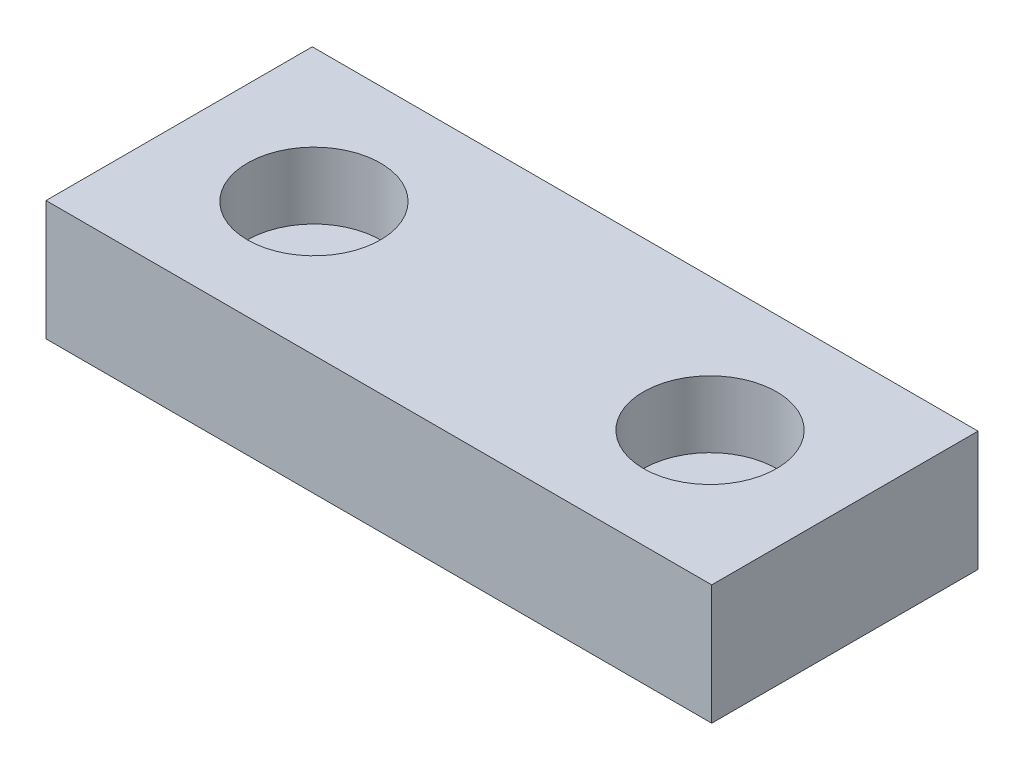
ISO-10303-21;
HEADER;
FILE_DESCRIPTION(('STEP AP214'),'2;1');
FILE_NAME('part.step','',(''),(''),'','','');
FILE_SCHEMA(('AUTOMOTIVE_DESIGN { 1 0 10303 214 1 1 1 1 }'));
ENDSEC;
DATA;
#1=APPLICATION_CONTEXT('core data for automotive mechanical design processes');
#2=APPLICATION_PROTOCOL_DEFINITION('international standard','automotive_design',2000,#1);
#3=PRODUCT_CONTEXT('',#1,'mechanical');
#4=PRODUCT('Part','Part','',(#3));
#5=PRODUCT_RELATED_PRODUCT_CATEGORY('part','',(#4));
#6=PRODUCT_DEFINITION_FORMATION('','',#4);
#7=PRODUCT_DEFINITION_CONTEXT('part definition',#1,'design');
#8=PRODUCT_DEFINITION('design','',#6,#7);
#9=PRODUCT_DEFINITION_SHAPE('','',#8);
#10=(LENGTH_UNIT() NAMED_UNIT(*) SI_UNIT(.MILLI.,.METRE.));
#11=(NAMED_UNIT(*) PLANE_ANGLE_UNIT() SI_UNIT($,.RADIAN.));
#12=(NAMED_UNIT(*) SI_UNIT($,.STERADIAN.) SOLID_ANGLE_UNIT());
#13=UNCERTAINTY_MEASURE_WITH_UNIT(LENGTH_MEASURE(1.E-05),#10,'distance_accuracy_value','');
#14=(GEOMETRIC_REPRESENTATION_CONTEXT(3) GLOBAL_UNCERTAINTY_ASSIGNED_CONTEXT((#13)) GLOBAL_UNIT_ASSIGNED_CONTEXT((#10,
#11,#12)) REPRESENTATION_CONTEXT('',''));
#15=CARTESIAN_POINT('',(0.,0.,0.));
#16=DIRECTION('',(0.,0.,1.));
#17=DIRECTION('',(1.,0.,0.));
#18=AXIS2_PLACEMENT_3D('',#15,#16,#17);
#19=CARTESIAN_POINT('',(0.,18.,20.));
#20=DIRECTION('',(0.,0.,-1.));
#21=DIRECTION('',(-1.,0.,0.));
#22=AXIS2_PLACEMENT_3D('',#19,#20,#21);
#23=PLANE('',#22);
#24=DIRECTION('',(1.,0.,0.));
#25=VECTOR('',#24,1.);
#26=CARTESIAN_POINT('',(0.,0.,20.));
#27=LINE('',#26,#25);
#28=CARTESIAN_POINT('',(-50.,0.,20.));
#29=VERTEX_POINT('',#28);
#30=CARTESIAN_POINT('',(50.,0.,20.));
#31=VERTEX_POINT('',#30);
#32=EDGE_CURVE('E112',#29,#31,#27,.T.);
#33=ORIENTED_EDGE('',*,*,#32,.T.);
#34=DIRECTION('',(0.,-1.,0.));
#35=VECTOR('',#34,1.);
#36=CARTESIAN_POINT('',(50.,18.,20.));
#37=LINE('',#36,#35);
#38=CARTESIAN_POINT('',(50.,18.,20.));
#39=VERTEX_POINT('',#38);
#40=EDGE_CURVE('E11',#39,#31,#37,.T.);
#41=ORIENTED_EDGE('',*,*,#40,.F.);
#42=DIRECTION('',(1.,0.,0.));
#43=VECTOR('',#42,1.);
#44=CARTESIAN_POINT('',(0.,18.,20.));
#45=LINE('',#44,#43);
#46=CARTESIAN_POINT('',(-50.,18.,20.));
#47=VERTEX_POINT('',#46);
#48=EDGE_CURVE('E92',#47,#39,#45,.T.);
#49=ORIENTED_EDGE('',*,*,#48,.F.);
#50=DIRECTION('',(0.,-1.,0.));
#51=VECTOR('',#50,1.);
#52=CARTESIAN_POINT('',(-50.,18.,20.));
#53=LINE('',#52,#51);
#54=EDGE_CURVE('E59',#47,#29,#53,.T.);
#55=ORIENTED_EDGE('',*,*,#54,.T.);
#56=EDGE_LOOP('',(#33,#41,#49,#55));
#57=FACE_BOUND('',#56,.T.);
#58=ADVANCED_FACE('F42',(#57),#23,.F.);
#59=CARTESIAN_POINT('',(50.,18.,0.));
#60=DIRECTION('',(-1.,0.,0.));
#61=DIRECTION('',(0.,0.,1.));
#62=AXIS2_PLACEMENT_3D('',#59,#60,#61);
#63=PLANE('',#62);
#64=DIRECTION('',(0.,0.,-1.));
#65=VECTOR('',#64,1.);
#66=CARTESIAN_POINT('',(50.,0.,0.));
#67=LINE('',#66,#65);
#68=CARTESIAN_POINT('',(50.,0.,-20.));
#69=VERTEX_POINT('',#68);
#70=EDGE_CURVE('E98',#31,#69,#67,.T.);
#71=ORIENTED_EDGE('',*,*,#70,.T.);
#72=DIRECTION('',(0.,-1.,0.));
#73=VECTOR('',#72,1.);
#74=CARTESIAN_POINT('',(50.,18.,-20.));
#75=LINE('',#74,#73);
#76=CARTESIAN_POINT('',(50.,18.,-20.));
#77=VERTEX_POINT('',#76);
#78=EDGE_CURVE('E51',#77,#69,#75,.T.);
#79=ORIENTED_EDGE('',*,*,#78,.F.);
#80=DIRECTION('',(0.,0.,-1.));
#81=VECTOR('',#80,1.);
#82=CARTESIAN_POINT('',(50.,18.,0.));
#83=LINE('',#82,#81);
#84=EDGE_CURVE('E84',#39,#77,#83,.T.);
#85=ORIENTED_EDGE('',*,*,#84,.F.);
#86=ORIENTED_EDGE('',*,*,#40,.T.);
#87=EDGE_LOOP('',(#71,#79,#85,#86));
#88=FACE_BOUND('',#87,.T.);
#89=ADVANCED_FACE('F97',(#88),#63,.F.);
#90=CARTESIAN_POINT('',(0.,18.,-20.));
#91=DIRECTION('',(0.,0.,-1.));
#92=DIRECTION('',(-1.,0.,0.));
#93=AXIS2_PLACEMENT_3D('',#90,#91,#92);
#94=PLANE('',#93);
#95=DIRECTION('',(1.,0.,0.));
#96=VECTOR('',#95,1.);
#97=CARTESIAN_POINT('',(0.,0.,-20.));
#98=LINE('',#97,#96);
#99=CARTESIAN_POINT('',(-50.,0.,-20.));
#100=VERTEX_POINT('',#99);
#101=EDGE_CURVE('E118',#100,#69,#98,.T.);
#102=ORIENTED_EDGE('',*,*,#101,.F.);
#103=DIRECTION('',(0.,-1.,0.));
#104=VECTOR('',#103,1.);
#105=CARTESIAN_POINT('',(-50.,18.,-20.));
#106=LINE('',#105,#104);
#107=CARTESIAN_POINT('',(-50.,18.,-20.));
#108=VERTEX_POINT('',#107);
#109=EDGE_CURVE('E73',#108,#100,#106,.T.);
#110=ORIENTED_EDGE('',*,*,#109,.F.);
#111=DIRECTION('',(1.,0.,0.));
#112=VECTOR('',#111,1.);
#113=CARTESIAN_POINT('',(0.,18.,-20.));
#114=LINE('',#113,#112);
#115=EDGE_CURVE('E91',#108,#77,#114,.T.);
#116=ORIENTED_EDGE('',*,*,#115,.T.);
#117=ORIENTED_EDGE('',*,*,#78,.T.);
#118=EDGE_LOOP('',(#102,#110,#116,#117));
#119=FACE_BOUND('',#118,.T.);
#120=ADVANCED_FACE('F102',(#119),#94,.T.);
#121=CARTESIAN_POINT('',(-50.,18.,0.));
#122=DIRECTION('',(-1.,0.,0.));
#123=DIRECTION('',(0.,0.,1.));
#124=AXIS2_PLACEMENT_3D('',#121,#122,#123);
#125=PLANE('',#124);
#126=DIRECTION('',(0.,0.,-1.));
#127=VECTOR('',#126,1.);
#128=CARTESIAN_POINT('',(-50.,0.,0.));
#129=LINE('',#128,#127);
#130=EDGE_CURVE('E121',#29,#100,#129,.T.);
#131=ORIENTED_EDGE('',*,*,#130,.F.);
#132=ORIENTED_EDGE('',*,*,#54,.F.);
#133=DIRECTION('',(0.,0.,-1.));
#134=VECTOR('',#133,1.);
#135=CARTESIAN_POINT('',(-50.,18.,0.));
#136=LINE('',#135,#134);
#137=EDGE_CURVE('E104',#47,#108,#136,.T.);
#138=ORIENTED_EDGE('',*,*,#137,.T.);
#139=ORIENTED_EDGE('',*,*,#109,.T.);
#140=EDGE_LOOP('',(#131,#132,#138,#139));
#141=FACE_BOUND('',#140,.T.);
#142=ADVANCED_FACE('F158',(#141),#125,.T.);
#143=CARTESIAN_POINT('',(0.,18.,0.));
#144=DIRECTION('',(0.,1.,0.));
#145=DIRECTION('',(0.,0.,1.));
#146=AXIS2_PLACEMENT_3D('',#143,#144,#145);
#147=PLANE('',#146);
#148=CARTESIAN_POINT('',(-29.75,18.,0.));
#149=DIRECTION('',(0.,1.,0.));
#150=DIRECTION('',(0.,0.,1.));
#151=AXIS2_PLACEMENT_3D('',#148,#149,#150);
#152=CIRCLE('',#151,10.);
#153=CARTESIAN_POINT('',(-29.75,18.,10.));
#154=VERTEX_POINT('',#153);
#155=EDGE_CURVE('E130',#154,#154,#152,.T.);
#156=ORIENTED_EDGE('',*,*,#155,.F.);
#157=EDGE_LOOP('',(#156));
#158=FACE_BOUND('',#157,.T.);
#159=CARTESIAN_POINT('',(29.75,18.,0.));
#160=DIRECTION('',(0.,1.,0.));
#161=DIRECTION('',(0.,0.,1.));
#162=AXIS2_PLACEMENT_3D('',#159,#160,#161);
#163=CIRCLE('',#162,10.);
#164=CARTESIAN_POINT('',(29.75,18.,10.));
#165=VERTEX_POINT('',#164);
#166=EDGE_CURVE('E131',#165,#165,#163,.T.);
#167=ORIENTED_EDGE('',*,*,#166,.F.);
#168=EDGE_LOOP('',(#167));
#169=FACE_BOUND('',#168,.T.);
#170=ORIENTED_EDGE('',*,*,#48,.T.);
#171=ORIENTED_EDGE('',*,*,#84,.T.);
#172=ORIENTED_EDGE('',*,*,#115,.F.);
#173=ORIENTED_EDGE('',*,*,#137,.F.);
#174=EDGE_LOOP('',(#170,#171,#172,#173));
#175=FACE_BOUND('',#174,.T.);
#176=ADVANCED_FACE('F88',(#158,#169,#175),#147,.T.);
#177=CARTESIAN_POINT('',(0.,0.,0.));
#178=DIRECTION('',(0.,1.,0.));
#179=DIRECTION('',(0.,0.,1.));
#180=AXIS2_PLACEMENT_3D('',#177,#178,#179);
#181=PLANE('',#180);
#182=ORIENTED_EDGE('',*,*,#32,.F.);
#183=ORIENTED_EDGE('',*,*,#130,.T.);
#184=ORIENTED_EDGE('',*,*,#101,.T.);
#185=ORIENTED_EDGE('',*,*,#70,.F.);
#186=EDGE_LOOP('',(#182,#183,#184,#185));
#187=FACE_BOUND('',#186,.T.);
#188=ADVANCED_FACE('F157',(#187),#181,.F.);
#189=CARTESIAN_POINT('',(29.75,8.,0.));
#190=DIRECTION('',(0.,1.,0.));
#191=DIRECTION('',(0.,0.,1.));
#192=AXIS2_PLACEMENT_3D('',#189,#190,#191);
#193=CYLINDRICAL_SURFACE('',#192,10.);
#194=CARTESIAN_POINT('',(29.75,8.,0.));
#195=DIRECTION('',(0.,1.,0.));
#196=DIRECTION('',(0.,0.,1.));
#197=AXIS2_PLACEMENT_3D('',#194,#195,#196);
#198=CIRCLE('',#197,10.);
#199=CARTESIAN_POINT('',(29.75,8.,10.));
#200=VERTEX_POINT('',#199);
#201=EDGE_CURVE('E128',#200,#200,#198,.T.);
#202=ORIENTED_EDGE('',*,*,#201,.F.);
#203=EDGE_LOOP('',(#202));
#204=FACE_BOUND('',#203,.T.);
#205=ORIENTED_EDGE('',*,*,#166,.T.);
#206=EDGE_LOOP('',(#205));
#207=FACE_BOUND('',#206,.T.);
#208=ADVANCED_FACE('F162',(#204,#207),#193,.F.);
#209=CARTESIAN_POINT('',(29.75,8.,0.));
#210=DIRECTION('',(0.,1.,0.));
#211=DIRECTION('',(0.,0.,1.));
#212=AXIS2_PLACEMENT_3D('',#209,#210,#211);
#213=PLANE('',#212);
#214=ORIENTED_EDGE('',*,*,#201,.T.);
#215=EDGE_LOOP('',(#214));
#216=FACE_BOUND('',#215,.T.);
#217=ADVANCED_FACE('F151',(#216),#213,.T.);
#218=CARTESIAN_POINT('',(-29.75,8.,0.));
#219=DIRECTION('',(0.,1.,0.));
#220=DIRECTION('',(0.,0.,1.));
#221=AXIS2_PLACEMENT_3D('',#218,#219,#220);
#222=CYLINDRICAL_SURFACE('',#221,10.);
#223=CARTESIAN_POINT('',(-29.75,8.,0.));
#224=DIRECTION('',(0.,1.,0.));
#225=DIRECTION('',(0.,0.,1.));
#226=AXIS2_PLACEMENT_3D('',#223,#224,#225);
#227=CIRCLE('',#226,10.);
#228=CARTESIAN_POINT('',(-29.75,8.,10.));
#229=VERTEX_POINT('',#228);
#230=EDGE_CURVE('E115',#229,#229,#227,.T.);
#231=ORIENTED_EDGE('',*,*,#230,.F.);
#232=EDGE_LOOP('',(#231));
#233=FACE_BOUND('',#232,.T.);
#234=ORIENTED_EDGE('',*,*,#155,.T.);
#235=EDGE_LOOP('',(#234));
#236=FACE_BOUND('',#235,.T.);
#237=ADVANCED_FACE('F148',(#233,#236),#222,.F.);
#238=CARTESIAN_POINT('',(-29.75,8.,0.));
#239=DIRECTION('',(0.,1.,0.));
#240=DIRECTION('',(0.,0.,1.));
#241=AXIS2_PLACEMENT_3D('',#238,#239,#240);
#242=PLANE('',#241);
#243=ORIENTED_EDGE('',*,*,#230,.T.);
#244=EDGE_LOOP('',(#243));
#245=FACE_BOUND('',#244,.T.);
#246=ADVANCED_FACE('F146',(#245),#242,.T.);
#247=CLOSED_SHELL('',(#58,#89,#120,#142,#176,#188,#208,#217,#237,#246));
#248=MANIFOLD_SOLID_BREP('B2',#247);
#249=ADVANCED_BREP_SHAPE_REPRESENTATION('',(#18,#248),#14);
#250=SHAPE_DEFINITION_REPRESENTATION(#9,#249);
ENDSEC;
END-ISO-10303-21;
